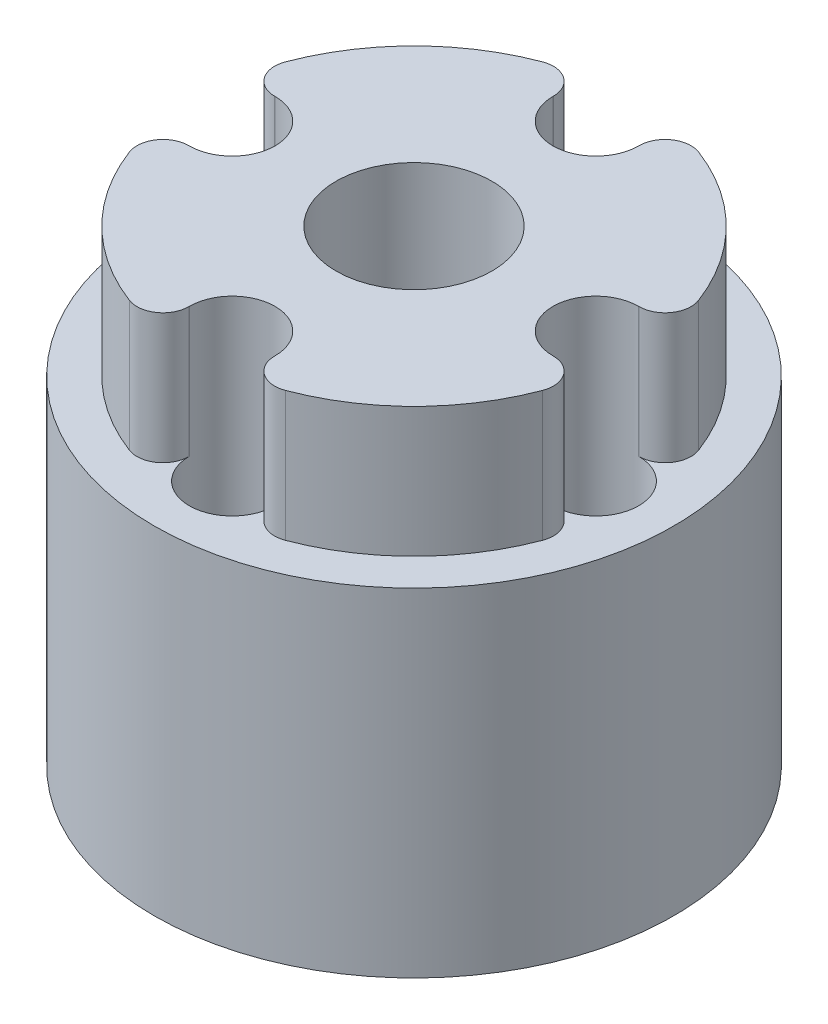
ISO-10303-21;
HEADER;
FILE_DESCRIPTION(('STEP AP214'),'2;1');
FILE_NAME('part.step','',(''),(''),'','','');
FILE_SCHEMA(('AUTOMOTIVE_DESIGN { 1 0 10303 214 1 1 1 1 }'));
ENDSEC;
DATA;
#1=APPLICATION_CONTEXT('core data for automotive mechanical design processes');
#2=APPLICATION_PROTOCOL_DEFINITION('international standard','automotive_design',2000,#1);
#3=PRODUCT_CONTEXT('',#1,'mechanical');
#4=PRODUCT('Part','Part','',(#3));
#5=PRODUCT_RELATED_PRODUCT_CATEGORY('part','',(#4));
#6=PRODUCT_DEFINITION_FORMATION('','',#4);
#7=PRODUCT_DEFINITION_CONTEXT('part definition',#1,'design');
#8=PRODUCT_DEFINITION('design','',#6,#7);
#9=PRODUCT_DEFINITION_SHAPE('','',#8);
#10=(LENGTH_UNIT() NAMED_UNIT(*) SI_UNIT(.MILLI.,.METRE.));
#11=(NAMED_UNIT(*) PLANE_ANGLE_UNIT() SI_UNIT($,.RADIAN.));
#12=(NAMED_UNIT(*) SI_UNIT($,.STERADIAN.) SOLID_ANGLE_UNIT());
#13=UNCERTAINTY_MEASURE_WITH_UNIT(LENGTH_MEASURE(1.E-05),#10,'distance_accuracy_value','');
#14=(GEOMETRIC_REPRESENTATION_CONTEXT(3) GLOBAL_UNCERTAINTY_ASSIGNED_CONTEXT((#13)) GLOBAL_UNIT_ASSIGNED_CONTEXT((#10,
#11,#12)) REPRESENTATION_CONTEXT('',''));
#15=CARTESIAN_POINT('',(0.,0.,0.));
#16=DIRECTION('',(0.,0.,1.));
#17=DIRECTION('',(1.,0.,0.));
#18=AXIS2_PLACEMENT_3D('',#15,#16,#17);
#19=CARTESIAN_POINT('',(0.,18.,0.));
#20=DIRECTION('',(0.,-1.,0.));
#21=DIRECTION('',(0.,0.,-1.));
#22=AXIS2_PLACEMENT_3D('',#19,#20,#21);
#23=CYLINDRICAL_SURFACE('',#22,8.5);
#24=CARTESIAN_POINT('',(0.,13.,0.));
#25=DIRECTION('',(0.,1.,0.));
#26=DIRECTION('',(0.,0.,1.));
#27=AXIS2_PLACEMENT_3D('',#24,#25,#26);
#28=CIRCLE('',#27,8.5);
#29=CARTESIAN_POINT('',(3.00333333333333,13.,7.95172867299236));
#30=VERTEX_POINT('',#29);
#31=CARTESIAN_POINT('',(7.9517286729924,13.,3.00333333333325));
#32=VERTEX_POINT('',#31);
#33=EDGE_CURVE('E654',#30,#32,#28,.T.);
#34=ORIENTED_EDGE('',*,*,#33,.T.);
#35=DIRECTION('',(0.,-1.,0.));
#36=VECTOR('',#35,1.);
#37=CARTESIAN_POINT('',(7.9517286729924,18.,3.00333333333325));
#38=LINE('',#37,#36);
#39=CARTESIAN_POINT('',(7.9517286729924,18.,3.00333333333325));
#40=VERTEX_POINT('',#39);
#41=EDGE_CURVE('E373',#32,#40,#38,.F.);
#42=ORIENTED_EDGE('',*,*,#41,.T.);
#43=CARTESIAN_POINT('',(0.,18.,0.));
#44=DIRECTION('',(0.,1.,0.));
#45=DIRECTION('',(0.,0.,1.));
#46=AXIS2_PLACEMENT_3D('',#43,#44,#45);
#47=CIRCLE('',#46,8.5);
#48=CARTESIAN_POINT('',(3.00333333333333,18.,7.95172867299236));
#49=VERTEX_POINT('',#48);
#50=EDGE_CURVE('E397',#49,#40,#47,.T.);
#51=ORIENTED_EDGE('',*,*,#50,.F.);
#52=DIRECTION('',(0.,-1.,0.));
#53=VECTOR('',#52,1.);
#54=CARTESIAN_POINT('',(3.00333333333333,18.,7.95172867299236));
#55=LINE('',#54,#53);
#56=EDGE_CURVE('E354',#49,#30,#55,.T.);
#57=ORIENTED_EDGE('',*,*,#56,.T.);
#58=EDGE_LOOP('',(#34,#42,#51,#57));
#59=FACE_BOUND('',#58,.T.);
#60=ADVANCED_FACE('F34',(#59),#23,.T.);
#61=CARTESIAN_POINT('',(7.95172867299233,18.,-3.00333333333342));
#62=VERTEX_POINT('',#61);
#63=CARTESIAN_POINT('',(3.00333333333333,18.,-7.95172867299237));
#64=VERTEX_POINT('',#63);
#65=EDGE_CURVE('E300',#62,#64,#47,.T.);
#66=ORIENTED_EDGE('',*,*,#65,.F.);
#67=DIRECTION('',(0.,-1.,0.));
#68=VECTOR('',#67,1.);
#69=CARTESIAN_POINT('',(7.95172867299233,18.,-3.00333333333342));
#70=LINE('',#69,#68);
#71=CARTESIAN_POINT('',(7.95172867299233,13.,-3.00333333333342));
#72=VERTEX_POINT('',#71);
#73=EDGE_CURVE('E371',#62,#72,#70,.T.);
#74=ORIENTED_EDGE('',*,*,#73,.T.);
#75=CARTESIAN_POINT('',(3.00333333333333,13.,-7.95172867299237));
#76=VERTEX_POINT('',#75);
#77=EDGE_CURVE('E292',#72,#76,#28,.T.);
#78=ORIENTED_EDGE('',*,*,#77,.T.);
#79=DIRECTION('',(0.,-1.,0.));
#80=VECTOR('',#79,1.);
#81=CARTESIAN_POINT('',(3.00333333333333,18.,-7.95172867299237));
#82=LINE('',#81,#80);
#83=EDGE_CURVE('E317',#76,#64,#82,.F.);
#84=ORIENTED_EDGE('',*,*,#83,.T.);
#85=EDGE_LOOP('',(#66,#74,#78,#84));
#86=FACE_BOUND('',#85,.T.);
#87=ADVANCED_FACE('F395',(#86),#23,.T.);
#88=CARTESIAN_POINT('',(-7.95172867299235,13.,3.00333333333336));
#89=VERTEX_POINT('',#88);
#90=CARTESIAN_POINT('',(-3.00333333333333,13.,7.95172867299237));
#91=VERTEX_POINT('',#90);
#92=EDGE_CURVE('E304',#89,#91,#28,.T.);
#93=ORIENTED_EDGE('',*,*,#92,.T.);
#94=DIRECTION('',(0.,-1.,0.));
#95=VECTOR('',#94,1.);
#96=CARTESIAN_POINT('',(-3.00333333333333,18.,7.95172867299237));
#97=LINE('',#96,#95);
#98=CARTESIAN_POINT('',(-3.00333333333333,18.,7.95172867299237));
#99=VERTEX_POINT('',#98);
#100=EDGE_CURVE('E356',#91,#99,#97,.F.);
#101=ORIENTED_EDGE('',*,*,#100,.T.);
#102=CARTESIAN_POINT('',(-7.95172867299235,18.,3.00333333333336));
#103=VERTEX_POINT('',#102);
#104=EDGE_CURVE('E299',#103,#99,#47,.T.);
#105=ORIENTED_EDGE('',*,*,#104,.F.);
#106=DIRECTION('',(0.,-1.,0.));
#107=VECTOR('',#106,1.);
#108=CARTESIAN_POINT('',(-7.95172867299235,18.,3.00333333333336));
#109=LINE('',#108,#107);
#110=EDGE_CURVE('E336',#103,#89,#109,.T.);
#111=ORIENTED_EDGE('',*,*,#110,.T.);
#112=EDGE_LOOP('',(#93,#101,#105,#111));
#113=FACE_BOUND('',#112,.T.);
#114=ADVANCED_FACE('F406',(#113),#23,.T.);
#115=CARTESIAN_POINT('',(0.,13.,0.));
#116=DIRECTION('',(0.,-1.,0.));
#117=DIRECTION('',(0.,0.,-1.));
#118=AXIS2_PLACEMENT_3D('',#115,#116,#117);
#119=CYLINDRICAL_SURFACE('',#118,10.);
#120=CARTESIAN_POINT('',(0.,13.,0.));
#121=DIRECTION('',(0.,1.,0.));
#122=DIRECTION('',(0.,0.,1.));
#123=AXIS2_PLACEMENT_3D('',#120,#121,#122);
#124=CIRCLE('',#123,10.);
#125=CARTESIAN_POINT('',(0.,13.,-10.));
#126=VERTEX_POINT('',#125);
#127=EDGE_CURVE('E305',#126,#126,#124,.T.);
#128=CARTESIAN_POINT('',(0.,0.,0.));
#129=DIRECTION('',(0.,1.,0.));
#130=DIRECTION('',(0.,0.,1.));
#131=AXIS2_PLACEMENT_3D('',#128,#129,#130);
#132=CIRCLE('',#131,10.);
#133=CARTESIAN_POINT('',(0.,0.,-10.));
#134=VERTEX_POINT('',#133);
#135=EDGE_CURVE('E298',#134,#134,#132,.T.);
#136=CARTESIAN_POINT('',(0.,13.,-10.));
#137=CARTESIAN_POINT('',(0.,12.8645833333333,-10.));
#138=CARTESIAN_POINT('',(0.,12.7291666666667,-10.));
#139=CARTESIAN_POINT('',(0.,12.4583333333333,-10.));
#140=CARTESIAN_POINT('',(0.,12.3229166666667,-10.));
#141=CARTESIAN_POINT('',(0.,12.0520833333333,-10.));
#142=CARTESIAN_POINT('',(0.,11.9166666666667,-10.));
#143=CARTESIAN_POINT('',(0.,11.6458333333333,-10.));
#144=CARTESIAN_POINT('',(0.,11.5104166666667,-10.));
#145=CARTESIAN_POINT('',(0.,11.2395833333333,-10.));
#146=CARTESIAN_POINT('',(0.,11.1041666666667,-10.));
#147=CARTESIAN_POINT('',(0.,10.8333333333333,-10.));
#148=CARTESIAN_POINT('',(0.,10.6979166666667,-10.));
#149=CARTESIAN_POINT('',(0.,10.4270833333333,-10.));
#150=CARTESIAN_POINT('',(0.,10.2916666666667,-10.));
#151=CARTESIAN_POINT('',(0.,10.0208333333333,-10.));
#152=CARTESIAN_POINT('',(0.,9.88541666666667,-10.));
#153=CARTESIAN_POINT('',(0.,9.61458333333333,-10.));
#154=CARTESIAN_POINT('',(0.,9.47916666666667,-10.));
#155=CARTESIAN_POINT('',(0.,9.20833333333333,-10.));
#156=CARTESIAN_POINT('',(0.,9.07291666666666,-10.));
#157=CARTESIAN_POINT('',(0.,8.80208333333333,-10.));
#158=CARTESIAN_POINT('',(0.,8.66666666666667,-10.));
#159=CARTESIAN_POINT('',(0.,8.39583333333333,-10.));
#160=CARTESIAN_POINT('',(0.,8.26041666666667,-10.));
#161=CARTESIAN_POINT('',(0.,7.98958333333333,-10.));
#162=CARTESIAN_POINT('',(0.,7.85416666666667,-10.));
#163=CARTESIAN_POINT('',(0.,7.58333333333333,-10.));
#164=CARTESIAN_POINT('',(0.,7.44791666666667,-10.));
#165=CARTESIAN_POINT('',(0.,7.17708333333333,-10.));
#166=CARTESIAN_POINT('',(0.,7.04166666666667,-10.));
#167=CARTESIAN_POINT('',(0.,6.77083333333333,-10.));
#168=CARTESIAN_POINT('',(0.,6.63541666666667,-10.));
#169=CARTESIAN_POINT('',(0.,6.36458333333333,-10.));
#170=CARTESIAN_POINT('',(0.,6.22916666666667,-10.));
#171=CARTESIAN_POINT('',(0.,5.95833333333333,-10.));
#172=CARTESIAN_POINT('',(0.,5.82291666666667,-10.));
#173=CARTESIAN_POINT('',(0.,5.55208333333333,-10.));
#174=CARTESIAN_POINT('',(0.,5.41666666666667,-10.));
#175=CARTESIAN_POINT('',(0.,5.14583333333333,-10.));
#176=CARTESIAN_POINT('',(0.,5.01041666666667,-10.));
#177=CARTESIAN_POINT('',(0.,4.73958333333333,-10.));
#178=CARTESIAN_POINT('',(0.,4.60416666666667,-10.));
#179=CARTESIAN_POINT('',(0.,4.33333333333333,-10.));
#180=CARTESIAN_POINT('',(0.,4.19791666666667,-10.));
#181=CARTESIAN_POINT('',(0.,3.92708333333333,-10.));
#182=CARTESIAN_POINT('',(0.,3.79166666666667,-10.));
#183=CARTESIAN_POINT('',(0.,3.52083333333333,-10.));
#184=CARTESIAN_POINT('',(0.,3.38541666666667,-10.));
#185=CARTESIAN_POINT('',(0.,3.11458333333333,-10.));
#186=CARTESIAN_POINT('',(0.,2.97916666666667,-10.));
#187=CARTESIAN_POINT('',(0.,2.70833333333333,-10.));
#188=CARTESIAN_POINT('',(0.,2.57291666666667,-10.));
#189=CARTESIAN_POINT('',(0.,2.30208333333333,-10.));
#190=CARTESIAN_POINT('',(0.,2.16666666666667,-10.));
#191=CARTESIAN_POINT('',(0.,1.89583333333333,-10.));
#192=CARTESIAN_POINT('',(0.,1.76041666666667,-10.));
#193=CARTESIAN_POINT('',(0.,1.48958333333333,-10.));
#194=CARTESIAN_POINT('',(0.,1.35416666666667,-10.));
#195=CARTESIAN_POINT('',(0.,1.08333333333333,-10.));
#196=CARTESIAN_POINT('',(0.,0.947916666666667,-10.));
#197=CARTESIAN_POINT('',(0.,0.677083333333334,-10.));
#198=CARTESIAN_POINT('',(0.,0.541666666666667,-10.));
#199=CARTESIAN_POINT('',(0.,0.270833333333334,-10.));
#200=CARTESIAN_POINT('',(0.,0.135416666666667,-10.));
#201=CARTESIAN_POINT('',(0.,0.,-10.));
#202=B_SPLINE_CURVE_WITH_KNOTS('',3,(#136,#137,#138,#139,#140,#141,#142,#143,#144,#145,#146,
#147,#148,#149,#150,#151,#152,#153,#154,#155,#156,#157,#158,#159,#160,#161,#162,#163,#164,#165,
#166,#167,#168,#169,#170,#171,#172,#173,#174,#175,#176,#177,#178,#179,#180,#181,#182,#183,#184,
#185,#186,#187,#188,#189,#190,#191,#192,#193,#194,#195,#196,#197,#198,#199,#200,#201),
.UNSPECIFIED.,.F.,.F.,(4,2,2,2,2,2,2,2,2,2,2,2,2,2,2,2,2,2,2,2,2,2,2,2,2,2,2,2,2,2,2,2,4),(0.,
0.40625,0.812500000000001,1.21875,1.625,2.03125,2.4375,2.84375,3.25,3.65625,4.0625,4.46875,
4.875,5.28125,5.6875,6.09375,6.5,6.90625,7.3125,7.71875,8.125,8.53125,8.9375,9.34375,9.75,
10.15625,10.5625,10.96875,11.375,11.78125,12.1875,12.59375,13.),.UNSPECIFIED.);
#203=EDGE_CURVE('BSEAM488',#126,#134,#202,.T.);
#204=ORIENTED_EDGE('',*,*,#127,.F.);
#205=ORIENTED_EDGE('',*,*,#135,.T.);
#206=ORIENTED_EDGE('',*,*,#203,.T.);
#207=ORIENTED_EDGE('',*,*,#203,.F.);
#208=EDGE_LOOP('',(#204,#206,#205,#207));
#209=FACE_BOUND('',#208,.T.);
#210=ADVANCED_FACE('F488',(#209),#119,.T.);
#211=CARTESIAN_POINT('',(0.,13.,0.));
#212=DIRECTION('',(0.,1.,0.));
#213=DIRECTION('',(0.,0.,1.));
#214=AXIS2_PLACEMENT_3D('',#211,#212,#213);
#215=PLANE('',#214);
#216=CARTESIAN_POINT('',(0.,13.,7.));
#217=DIRECTION('',(0.,1.,0.));
#218=DIRECTION('',(0.,0.,-1.));
#219=AXIS2_PLACEMENT_3D('',#216,#217,#218);
#220=CIRCLE('',#219,1.65);
#221=CARTESIAN_POINT('',(-1.65,13.,7.));
#222=VERTEX_POINT('',#221);
#223=CARTESIAN_POINT('',(1.65,13.,7.));
#224=VERTEX_POINT('',#223);
#225=EDGE_CURVE('E209',#222,#224,#220,.T.);
#226=ORIENTED_EDGE('',*,*,#225,.F.);
#227=DIRECTION('',(0.,0.,-1.));
#228=VECTOR('',#227,1.);
#229=CARTESIAN_POINT('',(-1.65,13.,8.33831517754036));
#230=LINE('',#229,#228);
#231=CARTESIAN_POINT('',(-1.65,13.,7.01623118205209));
#232=VERTEX_POINT('',#231);
#233=EDGE_CURVE('E195',#232,#222,#230,.T.);
#234=ORIENTED_EDGE('',*,*,#233,.F.);
#235=CARTESIAN_POINT('',(-2.65,13.,7.01623118205209));
#236=DIRECTION('',(0.,1.,0.));
#237=DIRECTION('',(0.,0.,1.));
#238=AXIS2_PLACEMENT_3D('',#235,#236,#237);
#239=CIRCLE('',#238,1.);
#240=EDGE_CURVE('E362',#232,#91,#239,.F.);
#241=ORIENTED_EDGE('',*,*,#240,.T.);
#242=ORIENTED_EDGE('',*,*,#92,.F.);
#243=CARTESIAN_POINT('',(-7.01623118205208,13.,2.65000000000002));
#244=DIRECTION('',(0.,1.,0.));
#245=DIRECTION('',(0.,0.,1.));
#246=AXIS2_PLACEMENT_3D('',#243,#244,#245);
#247=CIRCLE('',#246,1.);
#248=CARTESIAN_POINT('',(-7.01623118205208,13.,1.65000000000002));
#249=VERTEX_POINT('',#248);
#250=EDGE_CURVE('E343',#89,#249,#247,.F.);
#251=ORIENTED_EDGE('',*,*,#250,.T.);
#252=DIRECTION('',(-1.,0.,0.));
#253=VECTOR('',#252,1.);
#254=CARTESIAN_POINT('',(-6.99999999999999,13.,1.65000000000002));
#255=LINE('',#254,#253);
#256=CARTESIAN_POINT('',(-6.99999999999999,13.,1.65000000000002));
#257=VERTEX_POINT('',#256);
#258=EDGE_CURVE('E248',#257,#249,#255,.T.);
#259=ORIENTED_EDGE('',*,*,#258,.F.);
#260=CARTESIAN_POINT('',(-7.,13.,0.));
#261=DIRECTION('',(0.,1.,0.));
#262=DIRECTION('',(1.,0.,0.));
#263=AXIS2_PLACEMENT_3D('',#260,#261,#262);
#264=CIRCLE('',#263,1.65);
#265=CARTESIAN_POINT('',(-7.00000000000001,13.,-1.64999999999998));
#266=VERTEX_POINT('',#265);
#267=EDGE_CURVE('E423',#266,#257,#264,.T.);
#268=ORIENTED_EDGE('',*,*,#267,.F.);
#269=DIRECTION('',(1.,0.,0.));
#270=VECTOR('',#269,1.);
#271=CARTESIAN_POINT('',(-8.33831517754037,13.,-1.64999999999997));
#272=LINE('',#271,#270);
#273=CARTESIAN_POINT('',(-7.01623118205209,13.,-1.64999999999998));
#274=VERTEX_POINT('',#273);
#275=EDGE_CURVE('E251',#274,#266,#272,.T.);
#276=ORIENTED_EDGE('',*,*,#275,.F.);
#277=CARTESIAN_POINT('',(-7.0162311820521,13.,-2.64999999999998));
#278=DIRECTION('',(0.,1.,0.));
#279=DIRECTION('',(0.,0.,1.));
#280=AXIS2_PLACEMENT_3D('',#277,#278,#279);
#281=CIRCLE('',#280,1.);
#282=CARTESIAN_POINT('',(-7.95172867299238,13.,-3.00333333333331));
#283=VERTEX_POINT('',#282);
#284=EDGE_CURVE('E345',#274,#283,#281,.F.);
#285=ORIENTED_EDGE('',*,*,#284,.T.);
#286=CARTESIAN_POINT('',(-3.00333333333333,13.,-7.95172867299236));
#287=VERTEX_POINT('',#286);
#288=EDGE_CURVE('E301',#287,#283,#28,.T.);
#289=ORIENTED_EDGE('',*,*,#288,.F.);
#290=CARTESIAN_POINT('',(-2.65,13.,-7.01623118205209));
#291=DIRECTION('',(0.,1.,0.));
#292=DIRECTION('',(0.,0.,1.));
#293=AXIS2_PLACEMENT_3D('',#290,#291,#292);
#294=CIRCLE('',#293,1.);
#295=CARTESIAN_POINT('',(-1.65,13.,-7.01623118205209));
#296=VERTEX_POINT('',#295);
#297=EDGE_CURVE('E324',#287,#296,#294,.F.);
#298=ORIENTED_EDGE('',*,*,#297,.T.);
#299=DIRECTION('',(0.,0.,-1.));
#300=VECTOR('',#299,1.);
#301=CARTESIAN_POINT('',(-1.65,13.,-7.));
#302=LINE('',#301,#300);
#303=CARTESIAN_POINT('',(-1.65,13.,-7.));
#304=VERTEX_POINT('',#303);
#305=EDGE_CURVE('E271',#304,#296,#302,.T.);
#306=ORIENTED_EDGE('',*,*,#305,.F.);
#307=CARTESIAN_POINT('',(0.,13.,-7.));
#308=DIRECTION('',(0.,1.,0.));
#309=DIRECTION('',(0.,0.,1.));
#310=AXIS2_PLACEMENT_3D('',#307,#308,#309);
#311=CIRCLE('',#310,1.65);
#312=CARTESIAN_POINT('',(1.65,13.,-7.));
#313=VERTEX_POINT('',#312);
#314=EDGE_CURVE('E265',#313,#304,#311,.T.);
#315=ORIENTED_EDGE('',*,*,#314,.F.);
#316=DIRECTION('',(0.,0.,1.));
#317=VECTOR('',#316,1.);
#318=CARTESIAN_POINT('',(1.65,13.,-8.33831517754036));
#319=LINE('',#318,#317);
#320=CARTESIAN_POINT('',(1.65,13.,-7.01623118205209));
#321=VERTEX_POINT('',#320);
#322=EDGE_CURVE('E274',#321,#313,#319,.T.);
#323=ORIENTED_EDGE('',*,*,#322,.F.);
#324=CARTESIAN_POINT('',(2.65,13.,-7.01623118205209));
#325=DIRECTION('',(0.,1.,0.));
#326=DIRECTION('',(0.,0.,1.));
#327=AXIS2_PLACEMENT_3D('',#324,#325,#326);
#328=CIRCLE('',#327,1.);
#329=EDGE_CURVE('E326',#321,#76,#328,.F.);
#330=ORIENTED_EDGE('',*,*,#329,.T.);
#331=ORIENTED_EDGE('',*,*,#77,.F.);
#332=CARTESIAN_POINT('',(7.01623118205206,13.,-2.65000000000007));
#333=DIRECTION('',(0.,1.,0.));
#334=DIRECTION('',(0.,0.,1.));
#335=AXIS2_PLACEMENT_3D('',#332,#333,#334);
#336=CIRCLE('',#335,1.);
#337=CARTESIAN_POINT('',(7.01623118205207,13.,-1.65000000000007));
#338=VERTEX_POINT('',#337);
#339=EDGE_CURVE('E42',#72,#338,#336,.F.);
#340=ORIENTED_EDGE('',*,*,#339,.T.);
#341=DIRECTION('',(1.,0.,0.));
#342=VECTOR('',#341,1.);
#343=CARTESIAN_POINT('',(6.99999999999998,13.,-1.65000000000007));
#344=LINE('',#343,#342);
#345=CARTESIAN_POINT('',(6.99999999999998,13.,-1.65000000000007));
#346=VERTEX_POINT('',#345);
#347=EDGE_CURVE('E230',#346,#338,#344,.T.);
#348=ORIENTED_EDGE('',*,*,#347,.F.);
#349=CARTESIAN_POINT('',(7.,13.,0.));
#350=DIRECTION('',(0.,1.,0.));
#351=DIRECTION('',(-1.,0.,0.));
#352=AXIS2_PLACEMENT_3D('',#349,#350,#351);
#353=CIRCLE('',#352,1.65);
#354=CARTESIAN_POINT('',(7.00000000000002,13.,1.64999999999993));
#355=VERTEX_POINT('',#354);
#356=EDGE_CURVE('E665',#355,#346,#353,.T.);
#357=ORIENTED_EDGE('',*,*,#356,.F.);
#358=DIRECTION('',(-1.,0.,0.));
#359=VECTOR('',#358,1.);
#360=CARTESIAN_POINT('',(8.33831517754038,13.,1.64999999999991));
#361=LINE('',#360,#359);
#362=CARTESIAN_POINT('',(7.0162311820521,13.,1.64999999999993));
#363=VERTEX_POINT('',#362);
#364=EDGE_CURVE('E233',#363,#355,#361,.T.);
#365=ORIENTED_EDGE('',*,*,#364,.F.);
#366=CARTESIAN_POINT('',(7.01623118205211,13.,2.64999999999993));
#367=DIRECTION('',(0.,1.,0.));
#368=DIRECTION('',(0.,0.,1.));
#369=AXIS2_PLACEMENT_3D('',#366,#367,#368);
#370=CIRCLE('',#369,1.);
#371=EDGE_CURVE('E11',#363,#32,#370,.F.);
#372=ORIENTED_EDGE('',*,*,#371,.T.);
#373=ORIENTED_EDGE('',*,*,#33,.F.);
#374=CARTESIAN_POINT('',(2.65,13.,7.01623118205209));
#375=DIRECTION('',(0.,1.,0.));
#376=DIRECTION('',(0.,0.,1.));
#377=AXIS2_PLACEMENT_3D('',#374,#375,#376);
#378=CIRCLE('',#377,1.);
#379=CARTESIAN_POINT('',(1.65,13.,7.01623118205209));
#380=VERTEX_POINT('',#379);
#381=EDGE_CURVE('E360',#30,#380,#378,.F.);
#382=ORIENTED_EDGE('',*,*,#381,.T.);
#383=DIRECTION('',(0.,0.,1.));
#384=VECTOR('',#383,1.);
#385=CARTESIAN_POINT('',(1.65,13.,7.));
#386=LINE('',#385,#384);
#387=EDGE_CURVE('E206',#224,#380,#386,.T.);
#388=ORIENTED_EDGE('',*,*,#387,.F.);
#389=EDGE_LOOP('',(#226,#234,#241,#242,#251,#259,#268,#276,#285,#289,#298,#306,#315,#323,#330,
#331,#340,#348,#357,#365,#372,#373,#382,#388));
#390=FACE_BOUND('',#389,.T.);
#391=ORIENTED_EDGE('',*,*,#127,.T.);
#392=EDGE_LOOP('',(#391));
#393=FACE_BOUND('',#392,.T.);
#394=ADVANCED_FACE('F210',(#390,#393),#215,.T.);
#395=CARTESIAN_POINT('',(0.,0.,0.));
#396=DIRECTION('',(0.,1.,0.));
#397=DIRECTION('',(0.,0.,1.));
#398=AXIS2_PLACEMENT_3D('',#395,#396,#397);
#399=PLANE('',#398);
#400=CARTESIAN_POINT('',(0.,0.,7.));
#401=DIRECTION('',(0.,1.,0.));
#402=DIRECTION('',(0.,0.,-1.));
#403=AXIS2_PLACEMENT_3D('',#400,#401,#402);
#404=CIRCLE('',#403,1.65);
#405=CARTESIAN_POINT('',(0.,0.,5.35));
#406=VERTEX_POINT('',#405);
#407=EDGE_CURVE('E216',#406,#406,#404,.T.);
#408=ORIENTED_EDGE('',*,*,#407,.T.);
#409=EDGE_LOOP('',(#408));
#410=FACE_BOUND('',#409,.T.);
#411=CARTESIAN_POINT('',(7.,0.,0.));
#412=DIRECTION('',(0.,1.,0.));
#413=DIRECTION('',(-1.,0.,0.));
#414=AXIS2_PLACEMENT_3D('',#411,#412,#413);
#415=CIRCLE('',#414,1.65);
#416=CARTESIAN_POINT('',(5.35,0.,0.));
#417=VERTEX_POINT('',#416);
#418=EDGE_CURVE('E217',#417,#417,#415,.T.);
#419=ORIENTED_EDGE('',*,*,#418,.T.);
#420=EDGE_LOOP('',(#419));
#421=FACE_BOUND('',#420,.T.);
#422=CARTESIAN_POINT('',(-7.,0.,0.));
#423=DIRECTION('',(0.,1.,0.));
#424=DIRECTION('',(1.,0.,0.));
#425=AXIS2_PLACEMENT_3D('',#422,#423,#424);
#426=CIRCLE('',#425,1.65);
#427=CARTESIAN_POINT('',(-5.35,0.,0.));
#428=VERTEX_POINT('',#427);
#429=EDGE_CURVE('E238',#428,#428,#426,.T.);
#430=ORIENTED_EDGE('',*,*,#429,.T.);
#431=EDGE_LOOP('',(#430));
#432=FACE_BOUND('',#431,.T.);
#433=CARTESIAN_POINT('',(0.,0.,-7.));
#434=DIRECTION('',(0.,1.,0.));
#435=DIRECTION('',(0.,0.,1.));
#436=AXIS2_PLACEMENT_3D('',#433,#434,#435);
#437=CIRCLE('',#436,1.65);
#438=CARTESIAN_POINT('',(0.,0.,-5.35));
#439=VERTEX_POINT('',#438);
#440=EDGE_CURVE('E266',#439,#439,#437,.T.);
#441=ORIENTED_EDGE('',*,*,#440,.T.);
#442=EDGE_LOOP('',(#441));
#443=FACE_BOUND('',#442,.T.);
#444=CARTESIAN_POINT('',(0.,0.,0.));
#445=DIRECTION('',(0.,1.,0.));
#446=DIRECTION('',(0.,0.,1.));
#447=AXIS2_PLACEMENT_3D('',#444,#445,#446);
#448=CIRCLE('',#447,3.);
#449=CARTESIAN_POINT('',(0.,0.,3.));
#450=VERTEX_POINT('',#449);
#451=EDGE_CURVE('E289',#450,#450,#448,.T.);
#452=ORIENTED_EDGE('',*,*,#451,.T.);
#453=EDGE_LOOP('',(#452));
#454=FACE_BOUND('',#453,.T.);
#455=ORIENTED_EDGE('',*,*,#135,.F.);
#456=EDGE_LOOP('',(#455));
#457=FACE_BOUND('',#456,.T.);
#458=ADVANCED_FACE('F479',(#410,#421,#432,#443,#454,#457),#399,.F.);
#459=ORIENTED_EDGE('',*,*,#288,.T.);
#460=DIRECTION('',(0.,-1.,0.));
#461=VECTOR('',#460,1.);
#462=CARTESIAN_POINT('',(-7.95172867299237,18.,-3.00333333333331));
#463=LINE('',#462,#461);
#464=CARTESIAN_POINT('',(-7.95172867299238,18.,-3.00333333333331));
#465=VERTEX_POINT('',#464);
#466=EDGE_CURVE('E338',#283,#465,#463,.F.);
#467=ORIENTED_EDGE('',*,*,#466,.T.);
#468=CARTESIAN_POINT('',(-3.00333333333333,18.,-7.95172867299236));
#469=VERTEX_POINT('',#468);
#470=EDGE_CURVE('E295',#469,#465,#47,.T.);
#471=ORIENTED_EDGE('',*,*,#470,.F.);
#472=DIRECTION('',(0.,-1.,0.));
#473=VECTOR('',#472,1.);
#474=CARTESIAN_POINT('',(-3.00333333333333,18.,-7.95172867299236));
#475=LINE('',#474,#473);
#476=EDGE_CURVE('E320',#469,#287,#475,.T.);
#477=ORIENTED_EDGE('',*,*,#476,.T.);
#478=EDGE_LOOP('',(#459,#467,#471,#477));
#479=FACE_BOUND('',#478,.T.);
#480=ADVANCED_FACE('F436',(#479),#23,.T.);
#481=CARTESIAN_POINT('',(0.,18.,0.));
#482=DIRECTION('',(0.,1.,0.));
#483=DIRECTION('',(0.,0.,1.));
#484=AXIS2_PLACEMENT_3D('',#481,#482,#483);
#485=PLANE('',#484);
#486=DIRECTION('',(-1.,0.,0.));
#487=VECTOR('',#486,1.);
#488=CARTESIAN_POINT('',(6.99999999999998,18.,-1.65000000000007));
#489=LINE('',#488,#487);
#490=CARTESIAN_POINT('',(7.01623118205207,18.,-1.65000000000007));
#491=VERTEX_POINT('',#490);
#492=CARTESIAN_POINT('',(6.99999999999998,18.,-1.65000000000007));
#493=VERTEX_POINT('',#492);
#494=EDGE_CURVE('E240',#491,#493,#489,.T.);
#495=ORIENTED_EDGE('',*,*,#494,.F.);
#496=CARTESIAN_POINT('',(7.01623118205206,18.,-2.65000000000007));
#497=DIRECTION('',(0.,1.,0.));
#498=DIRECTION('',(0.,0.,1.));
#499=AXIS2_PLACEMENT_3D('',#496,#497,#498);
#500=CIRCLE('',#499,1.);
#501=EDGE_CURVE('E369',#491,#62,#500,.T.);
#502=ORIENTED_EDGE('',*,*,#501,.T.);
#503=ORIENTED_EDGE('',*,*,#65,.T.);
#504=CARTESIAN_POINT('',(2.65,18.,-7.01623118205209));
#505=DIRECTION('',(0.,1.,0.));
#506=DIRECTION('',(0.,0.,1.));
#507=AXIS2_PLACEMENT_3D('',#504,#505,#506);
#508=CIRCLE('',#507,1.);
#509=CARTESIAN_POINT('',(1.65,18.,-7.01623118205209));
#510=VERTEX_POINT('',#509);
#511=EDGE_CURVE('E313',#64,#510,#508,.T.);
#512=ORIENTED_EDGE('',*,*,#511,.T.);
#513=DIRECTION('',(0.,0.,-1.));
#514=VECTOR('',#513,1.);
#515=CARTESIAN_POINT('',(1.65,18.,-8.33831517754036));
#516=LINE('',#515,#514);
#517=CARTESIAN_POINT('',(1.65,18.,-7.));
#518=VERTEX_POINT('',#517);
#519=EDGE_CURVE('E277',#518,#510,#516,.T.);
#520=ORIENTED_EDGE('',*,*,#519,.F.);
#521=CARTESIAN_POINT('',(0.,18.,-7.));
#522=DIRECTION('',(0.,1.,0.));
#523=DIRECTION('',(0.,0.,1.));
#524=AXIS2_PLACEMENT_3D('',#521,#522,#523);
#525=CIRCLE('',#524,1.65);
#526=CARTESIAN_POINT('',(-1.65,18.,-7.));
#527=VERTEX_POINT('',#526);
#528=EDGE_CURVE('E269',#527,#518,#525,.T.);
#529=ORIENTED_EDGE('',*,*,#528,.F.);
#530=DIRECTION('',(0.,0.,1.));
#531=VECTOR('',#530,1.);
#532=CARTESIAN_POINT('',(-1.65,18.,-7.));
#533=LINE('',#532,#531);
#534=CARTESIAN_POINT('',(-1.65,18.,-7.01623118205209));
#535=VERTEX_POINT('',#534);
#536=EDGE_CURVE('E280',#535,#527,#533,.T.);
#537=ORIENTED_EDGE('',*,*,#536,.F.);
#538=CARTESIAN_POINT('',(-2.65,18.,-7.01623118205209));
#539=DIRECTION('',(0.,1.,0.));
#540=DIRECTION('',(0.,0.,1.));
#541=AXIS2_PLACEMENT_3D('',#538,#539,#540);
#542=CIRCLE('',#541,1.);
#543=EDGE_CURVE('E315',#535,#469,#542,.T.);
#544=ORIENTED_EDGE('',*,*,#543,.T.);
#545=ORIENTED_EDGE('',*,*,#470,.T.);
#546=CARTESIAN_POINT('',(-7.0162311820521,18.,-2.64999999999998));
#547=DIRECTION('',(0.,1.,0.));
#548=DIRECTION('',(0.,0.,1.));
#549=AXIS2_PLACEMENT_3D('',#546,#547,#548);
#550=CIRCLE('',#549,1.);
#551=CARTESIAN_POINT('',(-7.01623118205209,18.,-1.64999999999998));
#552=VERTEX_POINT('',#551);
#553=EDGE_CURVE('E332',#465,#552,#550,.T.);
#554=ORIENTED_EDGE('',*,*,#553,.T.);
#555=DIRECTION('',(-1.,0.,0.));
#556=VECTOR('',#555,1.);
#557=CARTESIAN_POINT('',(-8.33831517754037,18.,-1.64999999999997));
#558=LINE('',#557,#556);
#559=CARTESIAN_POINT('',(-7.00000000000001,18.,-1.64999999999998));
#560=VERTEX_POINT('',#559);
#561=EDGE_CURVE('E254',#560,#552,#558,.T.);
#562=ORIENTED_EDGE('',*,*,#561,.F.);
#563=CARTESIAN_POINT('',(-7.,18.,0.));
#564=DIRECTION('',(0.,1.,0.));
#565=DIRECTION('',(1.,0.,0.));
#566=AXIS2_PLACEMENT_3D('',#563,#564,#565);
#567=CIRCLE('',#566,1.65);
#568=CARTESIAN_POINT('',(-6.99999999999999,18.,1.65000000000002));
#569=VERTEX_POINT('',#568);
#570=EDGE_CURVE('E205',#569,#560,#567,.T.);
#571=ORIENTED_EDGE('',*,*,#570,.F.);
#572=DIRECTION('',(1.,0.,0.));
#573=VECTOR('',#572,1.);
#574=CARTESIAN_POINT('',(-6.99999999999999,18.,1.65000000000002));
#575=LINE('',#574,#573);
#576=CARTESIAN_POINT('',(-7.01623118205208,18.,1.65000000000002));
#577=VERTEX_POINT('',#576);
#578=EDGE_CURVE('E257',#577,#569,#575,.T.);
#579=ORIENTED_EDGE('',*,*,#578,.F.);
#580=CARTESIAN_POINT('',(-7.01623118205208,18.,2.65000000000002));
#581=DIRECTION('',(0.,1.,0.));
#582=DIRECTION('',(0.,0.,1.));
#583=AXIS2_PLACEMENT_3D('',#580,#581,#582);
#584=CIRCLE('',#583,1.);
#585=EDGE_CURVE('E334',#577,#103,#584,.T.);
#586=ORIENTED_EDGE('',*,*,#585,.T.);
#587=ORIENTED_EDGE('',*,*,#104,.T.);
#588=CARTESIAN_POINT('',(-2.65,18.,7.01623118205209));
#589=DIRECTION('',(0.,1.,0.));
#590=DIRECTION('',(0.,0.,1.));
#591=AXIS2_PLACEMENT_3D('',#588,#589,#590);
#592=CIRCLE('',#591,1.);
#593=CARTESIAN_POINT('',(-1.65,18.,7.01623118205209));
#594=VERTEX_POINT('',#593);
#595=EDGE_CURVE('E350',#99,#594,#592,.T.);
#596=ORIENTED_EDGE('',*,*,#595,.T.);
#597=DIRECTION('',(0.,0.,1.));
#598=VECTOR('',#597,1.);
#599=CARTESIAN_POINT('',(-1.65,18.,8.33831517754036));
#600=LINE('',#599,#598);
#601=CARTESIAN_POINT('',(-1.65,18.,7.));
#602=VERTEX_POINT('',#601);
#603=EDGE_CURVE('E227',#602,#594,#600,.T.);
#604=ORIENTED_EDGE('',*,*,#603,.F.);
#605=CARTESIAN_POINT('',(0.,18.,7.));
#606=DIRECTION('',(0.,1.,0.));
#607=DIRECTION('',(0.,0.,-1.));
#608=AXIS2_PLACEMENT_3D('',#605,#606,#607);
#609=CIRCLE('',#608,1.65);
#610=CARTESIAN_POINT('',(1.65,18.,7.));
#611=VERTEX_POINT('',#610);
#612=EDGE_CURVE('E222',#611,#602,#609,.T.);
#613=ORIENTED_EDGE('',*,*,#612,.F.);
#614=DIRECTION('',(0.,0.,-1.));
#615=VECTOR('',#614,1.);
#616=CARTESIAN_POINT('',(1.65,18.,7.));
#617=LINE('',#616,#615);
#618=CARTESIAN_POINT('',(1.65,18.,7.01623118205209));
#619=VERTEX_POINT('',#618);
#620=EDGE_CURVE('E224',#619,#611,#617,.T.);
#621=ORIENTED_EDGE('',*,*,#620,.F.);
#622=CARTESIAN_POINT('',(2.65,18.,7.01623118205209));
#623=DIRECTION('',(0.,1.,0.));
#624=DIRECTION('',(0.,0.,1.));
#625=AXIS2_PLACEMENT_3D('',#622,#623,#624);
#626=CIRCLE('',#625,1.);
#627=EDGE_CURVE('E352',#619,#49,#626,.T.);
#628=ORIENTED_EDGE('',*,*,#627,.T.);
#629=ORIENTED_EDGE('',*,*,#50,.T.);
#630=CARTESIAN_POINT('',(7.01623118205211,18.,2.64999999999993));
#631=DIRECTION('',(0.,1.,0.));
#632=DIRECTION('',(0.,0.,1.));
#633=AXIS2_PLACEMENT_3D('',#630,#631,#632);
#634=CIRCLE('',#633,1.);
#635=CARTESIAN_POINT('',(7.0162311820521,18.,1.64999999999993));
#636=VERTEX_POINT('',#635);
#637=EDGE_CURVE('E367',#40,#636,#634,.T.);
#638=ORIENTED_EDGE('',*,*,#637,.T.);
#639=DIRECTION('',(1.,0.,0.));
#640=VECTOR('',#639,1.);
#641=CARTESIAN_POINT('',(8.33831517754038,18.,1.64999999999991));
#642=LINE('',#641,#640);
#643=CARTESIAN_POINT('',(7.00000000000002,18.,1.64999999999993));
#644=VERTEX_POINT('',#643);
#645=EDGE_CURVE('E237',#644,#636,#642,.T.);
#646=ORIENTED_EDGE('',*,*,#645,.F.);
#647=CARTESIAN_POINT('',(7.,18.,0.));
#648=DIRECTION('',(0.,1.,0.));
#649=DIRECTION('',(-1.,0.,0.));
#650=AXIS2_PLACEMENT_3D('',#647,#648,#649);
#651=CIRCLE('',#650,1.65);
#652=EDGE_CURVE('E235',#493,#644,#651,.T.);
#653=ORIENTED_EDGE('',*,*,#652,.F.);
#654=EDGE_LOOP('',(#495,#502,#503,#512,#520,#529,#537,#544,#545,#554,#562,#571,#579,#586,#587,
#596,#604,#613,#621,#628,#629,#638,#646,#653));
#655=FACE_BOUND('',#654,.T.);
#656=CARTESIAN_POINT('',(0.,18.,0.));
#657=DIRECTION('',(0.,1.,0.));
#658=DIRECTION('',(0.,0.,1.));
#659=AXIS2_PLACEMENT_3D('',#656,#657,#658);
#660=CIRCLE('',#659,3.);
#661=CARTESIAN_POINT('',(0.,18.,3.));
#662=VERTEX_POINT('',#661);
#663=EDGE_CURVE('E288',#662,#662,#660,.T.);
#664=ORIENTED_EDGE('',*,*,#663,.F.);
#665=EDGE_LOOP('',(#664));
#666=FACE_BOUND('',#665,.T.);
#667=ADVANCED_FACE('F390',(#655,#666),#485,.T.);
#668=CARTESIAN_POINT('',(0.,0.,0.));
#669=DIRECTION('',(0.,1.,0.));
#670=DIRECTION('',(0.,0.,1.));
#671=AXIS2_PLACEMENT_3D('',#668,#669,#670);
#672=CYLINDRICAL_SURFACE('',#671,3.);
#673=ORIENTED_EDGE('',*,*,#451,.F.);
#674=EDGE_LOOP('',(#673));
#675=FACE_BOUND('',#674,.T.);
#676=ORIENTED_EDGE('',*,*,#663,.T.);
#677=EDGE_LOOP('',(#676));
#678=FACE_BOUND('',#677,.T.);
#679=ADVANCED_FACE('F484',(#675,#678),#672,.F.);
#680=CARTESIAN_POINT('',(0.,8.43792810227633,-7.));
#681=DIRECTION('',(0.,1.,0.));
#682=DIRECTION('',(0.,0.,1.));
#683=AXIS2_PLACEMENT_3D('',#680,#681,#682);
#684=CYLINDRICAL_SURFACE('',#683,1.65);
#685=DIRECTION('',(0.,1.,0.));
#686=VECTOR('',#685,1.);
#687=CARTESIAN_POINT('',(1.65,8.43792810227633,-7.));
#688=LINE('',#687,#686);
#689=EDGE_CURVE('E282',#313,#518,#688,.T.);
#690=ORIENTED_EDGE('',*,*,#689,.F.);
#691=ORIENTED_EDGE('',*,*,#314,.T.);
#692=DIRECTION('',(0.,1.,0.));
#693=VECTOR('',#692,1.);
#694=CARTESIAN_POINT('',(-1.65,8.43792810227633,-7.));
#695=LINE('',#694,#693);
#696=EDGE_CURVE('E275',#304,#527,#695,.T.);
#697=ORIENTED_EDGE('',*,*,#696,.T.);
#698=ORIENTED_EDGE('',*,*,#528,.T.);
#699=EDGE_LOOP('',(#690,#691,#697,#698));
#700=FACE_BOUND('',#699,.T.);
#701=ORIENTED_EDGE('',*,*,#440,.F.);
#702=EDGE_LOOP('',(#701));
#703=FACE_BOUND('',#702,.T.);
#704=ADVANCED_FACE('F451',(#700,#703),#684,.F.);
#705=CARTESIAN_POINT('',(-1.65,8.43792810227633,-7.));
#706=DIRECTION('',(-1.,0.,0.));
#707=DIRECTION('',(0.,0.,1.));
#708=AXIS2_PLACEMENT_3D('',#705,#706,#707);
#709=PLANE('',#708);
#710=ORIENTED_EDGE('',*,*,#305,.T.);
#711=DIRECTION('',(0.,-1.,0.));
#712=VECTOR('',#711,1.);
#713=CARTESIAN_POINT('',(-1.65,8.43792810227633,-7.01623118205209));
#714=LINE('',#713,#712);
#715=EDGE_CURVE('E308',#296,#535,#714,.F.);
#716=ORIENTED_EDGE('',*,*,#715,.T.);
#717=ORIENTED_EDGE('',*,*,#536,.T.);
#718=ORIENTED_EDGE('',*,*,#696,.F.);
#719=EDGE_LOOP('',(#710,#716,#717,#718));
#720=FACE_BOUND('',#719,.T.);
#721=ADVANCED_FACE('F446',(#720),#709,.F.);
#722=CARTESIAN_POINT('',(1.65,8.43792810227633,-8.33831517754036));
#723=DIRECTION('',(1.,0.,0.));
#724=DIRECTION('',(0.,0.,-1.));
#725=AXIS2_PLACEMENT_3D('',#722,#723,#724);
#726=PLANE('',#725);
#727=ORIENTED_EDGE('',*,*,#519,.T.);
#728=DIRECTION('',(0.,-1.,0.));
#729=VECTOR('',#728,1.);
#730=CARTESIAN_POINT('',(1.65,8.43792810227633,-7.01623118205209));
#731=LINE('',#730,#729);
#732=EDGE_CURVE('E322',#510,#321,#731,.T.);
#733=ORIENTED_EDGE('',*,*,#732,.T.);
#734=ORIENTED_EDGE('',*,*,#322,.T.);
#735=ORIENTED_EDGE('',*,*,#689,.T.);
#736=EDGE_LOOP('',(#727,#733,#734,#735));
#737=FACE_BOUND('',#736,.T.);
#738=ADVANCED_FACE('F456',(#737),#726,.F.);
#739=CARTESIAN_POINT('',(-2.65,18.,-7.01623118205209));
#740=DIRECTION('',(0.,-1.,0.));
#741=DIRECTION('',(0.,0.,-1.));
#742=AXIS2_PLACEMENT_3D('',#739,#740,#741);
#743=CYLINDRICAL_SURFACE('',#742,1.);
#744=ORIENTED_EDGE('',*,*,#297,.F.);
#745=ORIENTED_EDGE('',*,*,#476,.F.);
#746=ORIENTED_EDGE('',*,*,#543,.F.);
#747=ORIENTED_EDGE('',*,*,#715,.F.);
#748=EDGE_LOOP('',(#744,#745,#746,#747));
#749=FACE_BOUND('',#748,.T.);
#750=ADVANCED_FACE('F440',(#749),#743,.T.);
#751=CARTESIAN_POINT('',(2.65,18.,-7.01623118205209));
#752=DIRECTION('',(0.,-1.,0.));
#753=DIRECTION('',(0.,0.,-1.));
#754=AXIS2_PLACEMENT_3D('',#751,#752,#753);
#755=CYLINDRICAL_SURFACE('',#754,1.);
#756=ORIENTED_EDGE('',*,*,#329,.F.);
#757=ORIENTED_EDGE('',*,*,#732,.F.);
#758=ORIENTED_EDGE('',*,*,#511,.F.);
#759=ORIENTED_EDGE('',*,*,#83,.F.);
#760=EDGE_LOOP('',(#756,#757,#758,#759));
#761=FACE_BOUND('',#760,.T.);
#762=ADVANCED_FACE('F460',(#761),#755,.T.);
#763=CARTESIAN_POINT('',(-7.,8.43792810227633,0.));
#764=DIRECTION('',(0.,1.,0.));
#765=DIRECTION('',(0.,0.,1.));
#766=AXIS2_PLACEMENT_3D('',#763,#764,#765);
#767=CYLINDRICAL_SURFACE('',#766,1.65);
#768=DIRECTION('',(0.,1.,0.));
#769=VECTOR('',#768,1.);
#770=CARTESIAN_POINT('',(-7.00000000000001,8.43792810227633,-1.64999999999998));
#771=LINE('',#770,#769);
#772=EDGE_CURVE('E259',#266,#560,#771,.T.);
#773=ORIENTED_EDGE('',*,*,#772,.F.);
#774=ORIENTED_EDGE('',*,*,#267,.T.);
#775=DIRECTION('',(0.,1.,0.));
#776=VECTOR('',#775,1.);
#777=CARTESIAN_POINT('',(-6.99999999999999,8.43792810227633,1.65000000000002));
#778=LINE('',#777,#776);
#779=EDGE_CURVE('E252',#257,#569,#778,.T.);
#780=ORIENTED_EDGE('',*,*,#779,.T.);
#781=ORIENTED_EDGE('',*,*,#570,.T.);
#782=EDGE_LOOP('',(#773,#774,#780,#781));
#783=FACE_BOUND('',#782,.T.);
#784=ORIENTED_EDGE('',*,*,#429,.F.);
#785=EDGE_LOOP('',(#784));
#786=FACE_BOUND('',#785,.T.);
#787=ADVANCED_FACE('F421',(#783,#786),#767,.F.);
#788=CARTESIAN_POINT('',(-6.99999999999999,8.43792810227633,1.65000000000002));
#789=DIRECTION('',(0.,0.,1.));
#790=DIRECTION('',(1.,0.,0.));
#791=AXIS2_PLACEMENT_3D('',#788,#789,#790);
#792=PLANE('',#791);
#793=ORIENTED_EDGE('',*,*,#258,.T.);
#794=DIRECTION('',(0.,-1.,0.));
#795=VECTOR('',#794,1.);
#796=CARTESIAN_POINT('',(-7.01623118205208,8.43792810227633,1.65000000000002));
#797=LINE('',#796,#795);
#798=EDGE_CURVE('E329',#249,#577,#797,.F.);
#799=ORIENTED_EDGE('',*,*,#798,.T.);
#800=ORIENTED_EDGE('',*,*,#578,.T.);
#801=ORIENTED_EDGE('',*,*,#779,.F.);
#802=EDGE_LOOP('',(#793,#799,#800,#801));
#803=FACE_BOUND('',#802,.T.);
#804=ADVANCED_FACE('F417',(#803),#792,.F.);
#805=CARTESIAN_POINT('',(-8.33831517754037,8.43792810227633,-1.64999999999997));
#806=DIRECTION('',(0.,0.,-1.));
#807=DIRECTION('',(-1.,0.,0.));
#808=AXIS2_PLACEMENT_3D('',#805,#806,#807);
#809=PLANE('',#808);
#810=ORIENTED_EDGE('',*,*,#561,.T.);
#811=DIRECTION('',(0.,-1.,0.));
#812=VECTOR('',#811,1.);
#813=CARTESIAN_POINT('',(-7.01623118205209,8.43792810227633,-1.64999999999998));
#814=LINE('',#813,#812);
#815=EDGE_CURVE('E341',#552,#274,#814,.T.);
#816=ORIENTED_EDGE('',*,*,#815,.T.);
#817=ORIENTED_EDGE('',*,*,#275,.T.);
#818=ORIENTED_EDGE('',*,*,#772,.T.);
#819=EDGE_LOOP('',(#810,#816,#817,#818));
#820=FACE_BOUND('',#819,.T.);
#821=ADVANCED_FACE('F427',(#820),#809,.F.);
#822=CARTESIAN_POINT('',(7.,8.43792810227633,0.));
#823=DIRECTION('',(0.,1.,0.));
#824=DIRECTION('',(0.,0.,1.));
#825=AXIS2_PLACEMENT_3D('',#822,#823,#824);
#826=CYLINDRICAL_SURFACE('',#825,1.65);
#827=DIRECTION('',(0.,1.,0.));
#828=VECTOR('',#827,1.);
#829=CARTESIAN_POINT('',(7.00000000000002,8.43792810227633,1.64999999999993));
#830=LINE('',#829,#828);
#831=EDGE_CURVE('E242',#355,#644,#830,.T.);
#832=ORIENTED_EDGE('',*,*,#831,.F.);
#833=ORIENTED_EDGE('',*,*,#356,.T.);
#834=DIRECTION('',(0.,1.,0.));
#835=VECTOR('',#834,1.);
#836=CARTESIAN_POINT('',(6.99999999999998,8.43792810227633,-1.65000000000007));
#837=LINE('',#836,#835);
#838=EDGE_CURVE('E234',#346,#493,#837,.T.);
#839=ORIENTED_EDGE('',*,*,#838,.T.);
#840=ORIENTED_EDGE('',*,*,#652,.T.);
#841=EDGE_LOOP('',(#832,#833,#839,#840));
#842=FACE_BOUND('',#841,.T.);
#843=ORIENTED_EDGE('',*,*,#418,.F.);
#844=EDGE_LOOP('',(#843));
#845=FACE_BOUND('',#844,.T.);
#846=ADVANCED_FACE('F546',(#842,#845),#826,.F.);
#847=CARTESIAN_POINT('',(6.99999999999998,8.43792810227633,-1.65000000000007));
#848=DIRECTION('',(0.,0.,-1.));
#849=DIRECTION('',(-1.,0.,0.));
#850=AXIS2_PLACEMENT_3D('',#847,#848,#849);
#851=PLANE('',#850);
#852=ORIENTED_EDGE('',*,*,#347,.T.);
#853=DIRECTION('',(0.,-1.,0.));
#854=VECTOR('',#853,1.);
#855=CARTESIAN_POINT('',(7.01623118205207,8.43792810227633,-1.65000000000007));
#856=LINE('',#855,#854);
#857=EDGE_CURVE('E364',#338,#491,#856,.F.);
#858=ORIENTED_EDGE('',*,*,#857,.T.);
#859=ORIENTED_EDGE('',*,*,#494,.T.);
#860=ORIENTED_EDGE('',*,*,#838,.F.);
#861=EDGE_LOOP('',(#852,#858,#859,#860));
#862=FACE_BOUND('',#861,.T.);
#863=ADVANCED_FACE('F385',(#862),#851,.F.);
#864=CARTESIAN_POINT('',(8.33831517754038,8.43792810227633,1.64999999999991));
#865=DIRECTION('',(0.,0.,1.));
#866=DIRECTION('',(1.,0.,0.));
#867=AXIS2_PLACEMENT_3D('',#864,#865,#866);
#868=PLANE('',#867);
#869=ORIENTED_EDGE('',*,*,#645,.T.);
#870=DIRECTION('',(0.,-1.,0.));
#871=VECTOR('',#870,1.);
#872=CARTESIAN_POINT('',(7.0162311820521,8.43792810227633,1.64999999999993));
#873=LINE('',#872,#871);
#874=EDGE_CURVE('E49',#636,#363,#873,.T.);
#875=ORIENTED_EDGE('',*,*,#874,.T.);
#876=ORIENTED_EDGE('',*,*,#364,.T.);
#877=ORIENTED_EDGE('',*,*,#831,.T.);
#878=EDGE_LOOP('',(#869,#875,#876,#877));
#879=FACE_BOUND('',#878,.T.);
#880=ADVANCED_FACE('F565',(#879),#868,.F.);
#881=CARTESIAN_POINT('',(0.,8.43792810227633,7.));
#882=DIRECTION('',(0.,1.,0.));
#883=DIRECTION('',(0.,0.,1.));
#884=AXIS2_PLACEMENT_3D('',#881,#882,#883);
#885=CYLINDRICAL_SURFACE('',#884,1.65);
#886=DIRECTION('',(0.,1.,0.));
#887=VECTOR('',#886,1.);
#888=CARTESIAN_POINT('',(-1.65,8.43792810227633,7.));
#889=LINE('',#888,#887);
#890=EDGE_CURVE('E200',#222,#602,#889,.T.);
#891=ORIENTED_EDGE('',*,*,#890,.F.);
#892=ORIENTED_EDGE('',*,*,#225,.T.);
#893=DIRECTION('',(0.,1.,0.));
#894=VECTOR('',#893,1.);
#895=CARTESIAN_POINT('',(1.65,8.43792810227633,7.));
#896=LINE('',#895,#894);
#897=EDGE_CURVE('E223',#224,#611,#896,.T.);
#898=ORIENTED_EDGE('',*,*,#897,.T.);
#899=ORIENTED_EDGE('',*,*,#612,.T.);
#900=EDGE_LOOP('',(#891,#892,#898,#899));
#901=FACE_BOUND('',#900,.T.);
#902=ORIENTED_EDGE('',*,*,#407,.F.);
#903=EDGE_LOOP('',(#902));
#904=FACE_BOUND('',#903,.T.);
#905=ADVANCED_FACE('F219',(#901,#904),#885,.F.);
#906=CARTESIAN_POINT('',(1.65,8.43792810227633,7.));
#907=DIRECTION('',(1.,0.,0.));
#908=DIRECTION('',(0.,0.,-1.));
#909=AXIS2_PLACEMENT_3D('',#906,#907,#908);
#910=PLANE('',#909);
#911=ORIENTED_EDGE('',*,*,#387,.T.);
#912=DIRECTION('',(0.,-1.,0.));
#913=VECTOR('',#912,1.);
#914=CARTESIAN_POINT('',(1.65,8.43792810227633,7.01623118205209));
#915=LINE('',#914,#913);
#916=EDGE_CURVE('E347',#380,#619,#915,.F.);
#917=ORIENTED_EDGE('',*,*,#916,.T.);
#918=ORIENTED_EDGE('',*,*,#620,.T.);
#919=ORIENTED_EDGE('',*,*,#897,.F.);
#920=EDGE_LOOP('',(#911,#917,#918,#919));
#921=FACE_BOUND('',#920,.T.);
#922=ADVANCED_FACE('F582',(#921),#910,.F.);
#923=CARTESIAN_POINT('',(-1.65,8.43792810227633,8.33831517754036));
#924=DIRECTION('',(-1.,0.,0.));
#925=DIRECTION('',(0.,0.,1.));
#926=AXIS2_PLACEMENT_3D('',#923,#924,#925);
#927=PLANE('',#926);
#928=ORIENTED_EDGE('',*,*,#603,.T.);
#929=DIRECTION('',(0.,-1.,0.));
#930=VECTOR('',#929,1.);
#931=CARTESIAN_POINT('',(-1.65,8.43792810227633,7.01623118205209));
#932=LINE('',#931,#930);
#933=EDGE_CURVE('E203',#594,#232,#932,.T.);
#934=ORIENTED_EDGE('',*,*,#933,.T.);
#935=ORIENTED_EDGE('',*,*,#233,.T.);
#936=ORIENTED_EDGE('',*,*,#890,.T.);
#937=EDGE_LOOP('',(#928,#934,#935,#936));
#938=FACE_BOUND('',#937,.T.);
#939=ADVANCED_FACE('F198',(#938),#927,.F.);
#940=CARTESIAN_POINT('',(-7.01623118205208,18.,2.65000000000002));
#941=DIRECTION('',(0.,-1.,0.));
#942=DIRECTION('',(0.,0.,-1.));
#943=AXIS2_PLACEMENT_3D('',#940,#941,#942);
#944=CYLINDRICAL_SURFACE('',#943,1.);
#945=ORIENTED_EDGE('',*,*,#250,.F.);
#946=ORIENTED_EDGE('',*,*,#110,.F.);
#947=ORIENTED_EDGE('',*,*,#585,.F.);
#948=ORIENTED_EDGE('',*,*,#798,.F.);
#949=EDGE_LOOP('',(#945,#946,#947,#948));
#950=FACE_BOUND('',#949,.T.);
#951=ADVANCED_FACE('F411',(#950),#944,.T.);
#952=CARTESIAN_POINT('',(-7.0162311820521,18.,-2.64999999999998));
#953=DIRECTION('',(0.,-1.,0.));
#954=DIRECTION('',(0.,0.,-1.));
#955=AXIS2_PLACEMENT_3D('',#952,#953,#954);
#956=CYLINDRICAL_SURFACE('',#955,1.);
#957=ORIENTED_EDGE('',*,*,#284,.F.);
#958=ORIENTED_EDGE('',*,*,#815,.F.);
#959=ORIENTED_EDGE('',*,*,#553,.F.);
#960=ORIENTED_EDGE('',*,*,#466,.F.);
#961=EDGE_LOOP('',(#957,#958,#959,#960));
#962=FACE_BOUND('',#961,.T.);
#963=ADVANCED_FACE('F431',(#962),#956,.T.);
#964=CARTESIAN_POINT('',(2.65,18.,7.01623118205209));
#965=DIRECTION('',(0.,-1.,0.));
#966=DIRECTION('',(0.,0.,-1.));
#967=AXIS2_PLACEMENT_3D('',#964,#965,#966);
#968=CYLINDRICAL_SURFACE('',#967,1.);
#969=ORIENTED_EDGE('',*,*,#381,.F.);
#970=ORIENTED_EDGE('',*,*,#56,.F.);
#971=ORIENTED_EDGE('',*,*,#627,.F.);
#972=ORIENTED_EDGE('',*,*,#916,.F.);
#973=EDGE_LOOP('',(#969,#970,#971,#972));
#974=FACE_BOUND('',#973,.T.);
#975=ADVANCED_FACE('F614',(#974),#968,.T.);
#976=CARTESIAN_POINT('',(-2.65,18.,7.01623118205209));
#977=DIRECTION('',(0.,-1.,0.));
#978=DIRECTION('',(0.,0.,-1.));
#979=AXIS2_PLACEMENT_3D('',#976,#977,#978);
#980=CYLINDRICAL_SURFACE('',#979,1.);
#981=ORIENTED_EDGE('',*,*,#240,.F.);
#982=ORIENTED_EDGE('',*,*,#933,.F.);
#983=ORIENTED_EDGE('',*,*,#595,.F.);
#984=ORIENTED_EDGE('',*,*,#100,.F.);
#985=EDGE_LOOP('',(#981,#982,#983,#984));
#986=FACE_BOUND('',#985,.T.);
#987=ADVANCED_FACE('F623',(#986),#980,.T.);
#988=CARTESIAN_POINT('',(7.01623118205206,18.,-2.65000000000007));
#989=DIRECTION('',(0.,-1.,0.));
#990=DIRECTION('',(0.,0.,-1.));
#991=AXIS2_PLACEMENT_3D('',#988,#989,#990);
#992=CYLINDRICAL_SURFACE('',#991,1.);
#993=ORIENTED_EDGE('',*,*,#339,.F.);
#994=ORIENTED_EDGE('',*,*,#73,.F.);
#995=ORIENTED_EDGE('',*,*,#501,.F.);
#996=ORIENTED_EDGE('',*,*,#857,.F.);
#997=EDGE_LOOP('',(#993,#994,#995,#996));
#998=FACE_BOUND('',#997,.T.);
#999=ADVANCED_FACE('F387',(#998),#992,.T.);
#1000=CARTESIAN_POINT('',(7.01623118205211,18.,2.64999999999993));
#1001=DIRECTION('',(0.,-1.,0.));
#1002=DIRECTION('',(0.,0.,-1.));
#1003=AXIS2_PLACEMENT_3D('',#1000,#1001,#1002);
#1004=CYLINDRICAL_SURFACE('',#1003,1.);
#1005=ORIENTED_EDGE('',*,*,#371,.F.);
#1006=ORIENTED_EDGE('',*,*,#874,.F.);
#1007=ORIENTED_EDGE('',*,*,#637,.F.);
#1008=ORIENTED_EDGE('',*,*,#41,.F.);
#1009=EDGE_LOOP('',(#1005,#1006,#1007,#1008));
#1010=FACE_BOUND('',#1009,.T.);
#1011=ADVANCED_FACE('F36',(#1010),#1004,.T.);
#1012=CLOSED_SHELL('',(#60,#87,#114,#210,#394,#458,#480,#667,#679,#704,#721,#738,#750,#762,#787,
#804,#821,#846,#863,#880,#905,#922,#939,#951,#963,#975,#987,#999,#1011));
#1013=MANIFOLD_SOLID_BREP('B2',#1012);
#1014=ADVANCED_BREP_SHAPE_REPRESENTATION('',(#18,#1013),#14);
#1015=SHAPE_DEFINITION_REPRESENTATION(#9,#1014);
ENDSEC;
END-ISO-10303-21;
